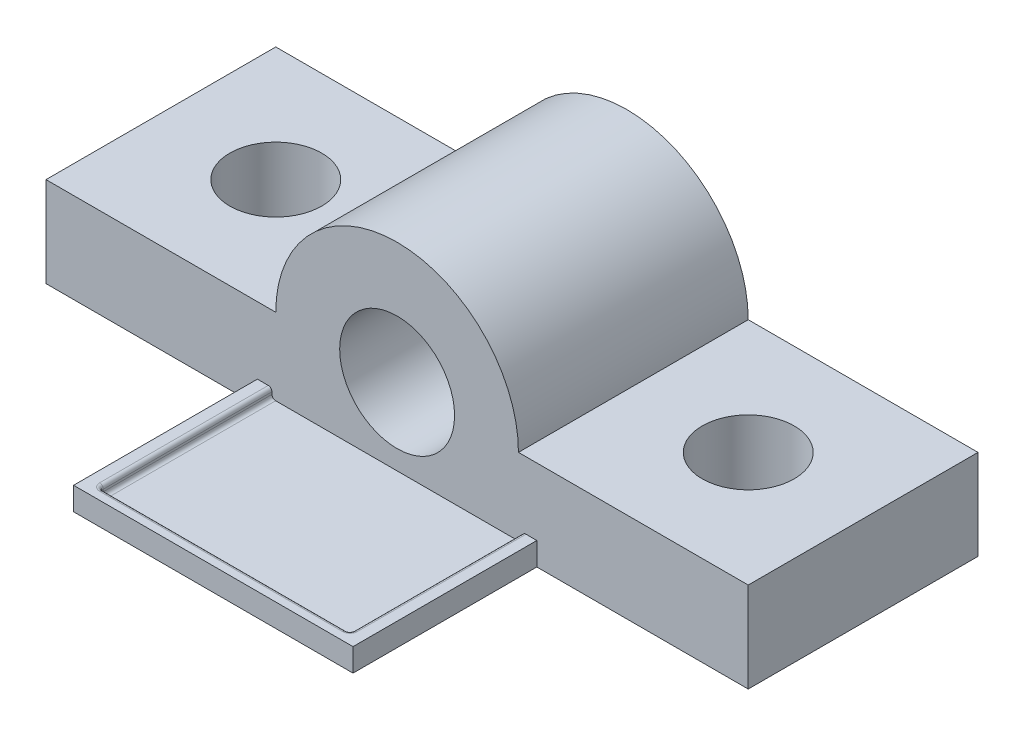
ISO-10303-21;
HEADER;
FILE_DESCRIPTION(('STEP AP214'),'2;1');
FILE_NAME('part.step','',(''),(''),'','','');
FILE_SCHEMA(('AUTOMOTIVE_DESIGN { 1 0 10303 214 1 1 1 1 }'));
ENDSEC;
DATA;
#1=APPLICATION_CONTEXT('core data for automotive mechanical design processes');
#2=APPLICATION_PROTOCOL_DEFINITION('international standard','automotive_design',2000,#1);
#3=PRODUCT_CONTEXT('',#1,'mechanical');
#4=PRODUCT('Part','Part','',(#3));
#5=PRODUCT_RELATED_PRODUCT_CATEGORY('part','',(#4));
#6=PRODUCT_DEFINITION_FORMATION('','',#4);
#7=PRODUCT_DEFINITION_CONTEXT('part definition',#1,'design');
#8=PRODUCT_DEFINITION('design','',#6,#7);
#9=PRODUCT_DEFINITION_SHAPE('','',#8);
#10=(LENGTH_UNIT() NAMED_UNIT(*) SI_UNIT(.MILLI.,.METRE.));
#11=(NAMED_UNIT(*) PLANE_ANGLE_UNIT() SI_UNIT($,.RADIAN.));
#12=(NAMED_UNIT(*) SI_UNIT($,.STERADIAN.) SOLID_ANGLE_UNIT());
#13=UNCERTAINTY_MEASURE_WITH_UNIT(LENGTH_MEASURE(1.E-05),#10,'distance_accuracy_value','');
#14=(GEOMETRIC_REPRESENTATION_CONTEXT(3) GLOBAL_UNCERTAINTY_ASSIGNED_CONTEXT((#13)) GLOBAL_UNIT_ASSIGNED_CONTEXT((#10,
#11,#12)) REPRESENTATION_CONTEXT('',''));
#15=CARTESIAN_POINT('',(0.,0.,0.));
#16=DIRECTION('',(0.,0.,1.));
#17=DIRECTION('',(1.,0.,0.));
#18=AXIS2_PLACEMENT_3D('',#15,#16,#17);
#19=CARTESIAN_POINT('',(-6.91794786838429,-19.7916456549118,16.51));
#20=DIRECTION('',(-1.,0.,0.));
#21=DIRECTION('',(0.,0.,1.));
#22=AXIS2_PLACEMENT_3D('',#19,#20,#21);
#23=PLANE('',#22);
#24=DIRECTION('',(0.,0.,-1.));
#25=VECTOR('',#24,1.);
#26=CARTESIAN_POINT('',(-6.91794786838429,-19.9948456549118,16.51));
#27=LINE('',#26,#25);
#28=CARTESIAN_POINT('',(-6.91794786838429,-19.9948456549118,6.35));
#29=VERTEX_POINT('',#28);
#30=CARTESIAN_POINT('',(-6.91794786838429,-19.9948456549118,15.6718));
#31=VERTEX_POINT('',#30);
#32=EDGE_CURVE('E301',#29,#31,#27,.F.);
#33=ORIENTED_EDGE('',*,*,#32,.T.);
#34=DIRECTION('',(0.,-1.,0.));
#35=VECTOR('',#34,1.);
#36=CARTESIAN_POINT('',(-6.91794786838429,-20.1193059575727,15.6718));
#37=LINE('',#36,#35);
#38=CARTESIAN_POINT('',(-6.91794786838429,-20.1193059575727,15.6718));
#39=VERTEX_POINT('',#38);
#40=EDGE_CURVE('E320',#31,#39,#37,.T.);
#41=ORIENTED_EDGE('',*,*,#40,.T.);
#42=DIRECTION('',(0.,0.,-1.));
#43=VECTOR('',#42,1.);
#44=CARTESIAN_POINT('',(-6.91794786838429,-20.1193059575727,6.35));
#45=LINE('',#44,#43);
#46=CARTESIAN_POINT('',(-6.91794786838429,-20.1193059575727,6.35));
#47=VERTEX_POINT('',#46);
#48=EDGE_CURVE('E299',#39,#47,#45,.T.);
#49=ORIENTED_EDGE('',*,*,#48,.T.);
#50=DIRECTION('',(0.,1.,0.));
#51=VECTOR('',#50,1.);
#52=CARTESIAN_POINT('',(-6.91794786838429,-19.7916456549118,6.35));
#53=LINE('',#52,#51);
#54=EDGE_CURVE('E215',#47,#29,#53,.T.);
#55=ORIENTED_EDGE('',*,*,#54,.T.);
#56=EDGE_LOOP('',(#33,#41,#49,#55));
#57=FACE_BOUND('',#56,.T.);
#58=ADVANCED_FACE('F35',(#57),#23,.F.);
#59=CARTESIAN_POINT('',(6.91794786838429,-19.7916456549118,16.51));
#60=DIRECTION('',(1.,0.,0.));
#61=DIRECTION('',(0.,0.,-1.));
#62=AXIS2_PLACEMENT_3D('',#59,#60,#61);
#63=PLANE('',#62);
#64=DIRECTION('',(0.,0.,-1.));
#65=VECTOR('',#64,1.);
#66=CARTESIAN_POINT('',(6.91794786838429,-20.1193059575727,16.51));
#67=LINE('',#66,#65);
#68=CARTESIAN_POINT('',(6.91794786838429,-20.1193059575727,6.35));
#69=VERTEX_POINT('',#68);
#70=CARTESIAN_POINT('',(6.91794786838429,-20.1193059575727,15.6718));
#71=VERTEX_POINT('',#70);
#72=EDGE_CURVE('E290',#69,#71,#67,.F.);
#73=ORIENTED_EDGE('',*,*,#72,.T.);
#74=DIRECTION('',(0.,1.,0.));
#75=VECTOR('',#74,1.);
#76=CARTESIAN_POINT('',(6.91794786838429,-19.9948456549118,15.6718));
#77=LINE('',#76,#75);
#78=CARTESIAN_POINT('',(6.91794786838429,-19.9948456549118,15.6718));
#79=VERTEX_POINT('',#78);
#80=EDGE_CURVE('E335',#71,#79,#77,.T.);
#81=ORIENTED_EDGE('',*,*,#80,.T.);
#82=DIRECTION('',(0.,0.,-1.));
#83=VECTOR('',#82,1.);
#84=CARTESIAN_POINT('',(6.91794786838429,-19.9948456549118,16.51));
#85=LINE('',#84,#83);
#86=CARTESIAN_POINT('',(6.91794786838429,-19.9948456549118,6.35));
#87=VERTEX_POINT('',#86);
#88=EDGE_CURVE('E293',#79,#87,#85,.T.);
#89=ORIENTED_EDGE('',*,*,#88,.T.);
#90=DIRECTION('',(0.,-1.,0.));
#91=VECTOR('',#90,1.);
#92=CARTESIAN_POINT('',(6.91794786838429,-19.7916456549118,6.35));
#93=LINE('',#92,#91);
#94=EDGE_CURVE('E208',#87,#69,#93,.T.);
#95=ORIENTED_EDGE('',*,*,#94,.T.);
#96=EDGE_LOOP('',(#73,#81,#89,#95));
#97=FACE_BOUND('',#96,.T.);
#98=ADVANCED_FACE('F379',(#97),#63,.F.);
#99=CARTESIAN_POINT('',(6.91794786838429,-20.3225059575727,16.51));
#100=DIRECTION('',(0.,-1.,0.));
#101=DIRECTION('',(0.,0.,-1.));
#102=AXIS2_PLACEMENT_3D('',#99,#100,#101);
#103=PLANE('',#102);
#104=DIRECTION('',(0.,0.,-1.));
#105=VECTOR('',#104,1.);
#106=CARTESIAN_POINT('',(-6.71474786838429,-20.3225059575727,16.51));
#107=LINE('',#106,#105);
#108=CARTESIAN_POINT('',(-6.71474786838429,-20.3225059575727,6.35));
#109=VERTEX_POINT('',#108);
#110=CARTESIAN_POINT('',(-6.71474786838429,-20.3225059575727,15.6718));
#111=VERTEX_POINT('',#110);
#112=EDGE_CURVE('E304',#109,#111,#107,.F.);
#113=ORIENTED_EDGE('',*,*,#112,.T.);
#114=DIRECTION('',(1.,0.,0.));
#115=VECTOR('',#114,1.);
#116=CARTESIAN_POINT('',(6.71474786838429,-20.3225059575727,15.6718));
#117=LINE('',#116,#115);
#118=CARTESIAN_POINT('',(6.71474786838429,-20.3225059575727,15.6718));
#119=VERTEX_POINT('',#118);
#120=EDGE_CURVE('E340',#111,#119,#117,.T.);
#121=ORIENTED_EDGE('',*,*,#120,.T.);
#122=DIRECTION('',(0.,0.,-1.));
#123=VECTOR('',#122,1.);
#124=CARTESIAN_POINT('',(6.71474786838429,-20.3225059575727,6.35));
#125=LINE('',#124,#123);
#126=CARTESIAN_POINT('',(6.71474786838429,-20.3225059575727,6.35));
#127=VERTEX_POINT('',#126);
#128=EDGE_CURVE('E307',#119,#127,#125,.T.);
#129=ORIENTED_EDGE('',*,*,#128,.T.);
#130=DIRECTION('',(-1.,0.,0.));
#131=VECTOR('',#130,1.);
#132=CARTESIAN_POINT('',(6.91794786838429,-20.3225059575727,6.35));
#133=LINE('',#132,#131);
#134=EDGE_CURVE('E204',#127,#109,#133,.T.);
#135=ORIENTED_EDGE('',*,*,#134,.T.);
#136=EDGE_LOOP('',(#113,#121,#129,#135));
#137=FACE_BOUND('',#136,.T.);
#138=ADVANCED_FACE('F391',(#137),#103,.F.);
#139=CARTESIAN_POINT('',(7.12114786838429,-19.9948456549118,16.51));
#140=DIRECTION('',(0.,0.,-1.));
#141=DIRECTION('',(-1.,0.,0.));
#142=AXIS2_PLACEMENT_3D('',#139,#140,#141);
#143=CYLINDRICAL_SURFACE('',#142,0.2032);
#144=ORIENTED_EDGE('',*,*,#88,.F.);
#145=CARTESIAN_POINT('',(7.12114786838429,-19.9948456549118,15.6718));
#146=DIRECTION('',(0.,0.,-1.));
#147=DIRECTION('',(-1.,0.,0.));
#148=AXIS2_PLACEMENT_3D('',#145,#146,#147);
#149=CIRCLE('',#148,0.2032);
#150=CARTESIAN_POINT('',(7.12114786838429,-19.7916456549118,15.6718));
#151=VERTEX_POINT('',#150);
#152=EDGE_CURVE('E333',#79,#151,#149,.T.);
#153=ORIENTED_EDGE('',*,*,#152,.T.);
#154=DIRECTION('',(0.,0.,-1.));
#155=VECTOR('',#154,1.);
#156=CARTESIAN_POINT('',(7.12114786838429,-19.7916456549118,16.51));
#157=LINE('',#156,#155);
#158=CARTESIAN_POINT('',(7.12114786838429,-19.7916456549118,6.35));
#159=VERTEX_POINT('',#158);
#160=EDGE_CURVE('E295',#159,#151,#157,.F.);
#161=ORIENTED_EDGE('',*,*,#160,.F.);
#162=CARTESIAN_POINT('',(7.12114786838429,-19.9948456549118,6.35));
#163=DIRECTION('',(0.,0.,1.));
#164=DIRECTION('',(1.,0.,0.));
#165=AXIS2_PLACEMENT_3D('',#162,#163,#164);
#166=CIRCLE('',#165,0.2032);
#167=EDGE_CURVE('E313',#87,#159,#166,.F.);
#168=ORIENTED_EDGE('',*,*,#167,.F.);
#169=EDGE_LOOP('',(#144,#153,#161,#168));
#170=FACE_BOUND('',#169,.T.);
#171=ADVANCED_FACE('F433',(#170),#143,.T.);
#172=CARTESIAN_POINT('',(-7.12114786838429,-19.9948456549118,16.51));
#173=DIRECTION('',(0.,0.,-1.));
#174=DIRECTION('',(-1.,0.,0.));
#175=AXIS2_PLACEMENT_3D('',#172,#173,#174);
#176=CYLINDRICAL_SURFACE('',#175,0.2032);
#177=DIRECTION('',(0.,0.,-1.));
#178=VECTOR('',#177,1.);
#179=CARTESIAN_POINT('',(-7.12114786838429,-19.7916456549118,16.51));
#180=LINE('',#179,#178);
#181=CARTESIAN_POINT('',(-7.12114786838429,-19.7916456549118,15.6718));
#182=VERTEX_POINT('',#181);
#183=CARTESIAN_POINT('',(-7.12114786838429,-19.7916456549118,6.35));
#184=VERTEX_POINT('',#183);
#185=EDGE_CURVE('E297',#182,#184,#180,.T.);
#186=ORIENTED_EDGE('',*,*,#185,.F.);
#187=CARTESIAN_POINT('',(-7.12114786838429,-19.9948456549118,15.6718));
#188=DIRECTION('',(0.,0.,-1.));
#189=DIRECTION('',(-1.,0.,0.));
#190=AXIS2_PLACEMENT_3D('',#187,#188,#189);
#191=CIRCLE('',#190,0.2032);
#192=EDGE_CURVE('E317',#182,#31,#191,.T.);
#193=ORIENTED_EDGE('',*,*,#192,.T.);
#194=ORIENTED_EDGE('',*,*,#32,.F.);
#195=CARTESIAN_POINT('',(-7.12114786838429,-19.9948456549118,6.35));
#196=DIRECTION('',(0.,0.,1.));
#197=DIRECTION('',(1.,0.,0.));
#198=AXIS2_PLACEMENT_3D('',#195,#196,#197);
#199=CIRCLE('',#198,0.2032);
#200=EDGE_CURVE('E315',#184,#29,#199,.F.);
#201=ORIENTED_EDGE('',*,*,#200,.F.);
#202=EDGE_LOOP('',(#186,#193,#194,#201));
#203=FACE_BOUND('',#202,.T.);
#204=ADVANCED_FACE('F421',(#203),#176,.T.);
#205=CARTESIAN_POINT('',(6.71474786838429,-20.1193059575727,16.51));
#206=DIRECTION('',(0.,0.,1.));
#207=DIRECTION('',(1.,0.,0.));
#208=AXIS2_PLACEMENT_3D('',#205,#206,#207);
#209=CYLINDRICAL_SURFACE('',#208,0.2032);
#210=ORIENTED_EDGE('',*,*,#128,.F.);
#211=CARTESIAN_POINT('',(6.71474786838429,-20.1193059575727,15.6718));
#212=DIRECTION('',(0.,0.,1.));
#213=DIRECTION('',(1.,0.,0.));
#214=AXIS2_PLACEMENT_3D('',#211,#212,#213);
#215=CIRCLE('',#214,0.2032);
#216=EDGE_CURVE('E337',#119,#71,#215,.T.);
#217=ORIENTED_EDGE('',*,*,#216,.T.);
#218=ORIENTED_EDGE('',*,*,#72,.F.);
#219=CARTESIAN_POINT('',(6.71474786838429,-20.1193059575727,6.35));
#220=DIRECTION('',(0.,0.,1.));
#221=DIRECTION('',(1.,0.,0.));
#222=AXIS2_PLACEMENT_3D('',#219,#220,#221);
#223=CIRCLE('',#222,0.2032);
#224=EDGE_CURVE('E311',#127,#69,#223,.T.);
#225=ORIENTED_EDGE('',*,*,#224,.F.);
#226=EDGE_LOOP('',(#210,#217,#218,#225));
#227=FACE_BOUND('',#226,.T.);
#228=ADVANCED_FACE('F376',(#227),#209,.F.);
#229=CARTESIAN_POINT('',(-6.71474786838429,-20.1193059575727,16.51));
#230=DIRECTION('',(0.,0.,1.));
#231=DIRECTION('',(1.,0.,0.));
#232=AXIS2_PLACEMENT_3D('',#229,#230,#231);
#233=CYLINDRICAL_SURFACE('',#232,0.2032);
#234=ORIENTED_EDGE('',*,*,#48,.F.);
#235=CARTESIAN_POINT('',(-6.71474786838429,-20.1193059575727,15.6718));
#236=DIRECTION('',(0.,0.,1.));
#237=DIRECTION('',(1.,0.,0.));
#238=AXIS2_PLACEMENT_3D('',#235,#236,#237);
#239=CIRCLE('',#238,0.2032);
#240=EDGE_CURVE('E331',#39,#111,#239,.T.);
#241=ORIENTED_EDGE('',*,*,#240,.T.);
#242=ORIENTED_EDGE('',*,*,#112,.F.);
#243=CARTESIAN_POINT('',(-6.71474786838429,-20.1193059575727,6.35));
#244=DIRECTION('',(0.,0.,1.));
#245=DIRECTION('',(1.,0.,0.));
#246=AXIS2_PLACEMENT_3D('',#243,#244,#245);
#247=CIRCLE('',#246,0.2032);
#248=EDGE_CURVE('E309',#47,#109,#247,.T.);
#249=ORIENTED_EDGE('',*,*,#248,.F.);
#250=EDGE_LOOP('',(#234,#241,#242,#249));
#251=FACE_BOUND('',#250,.T.);
#252=ADVANCED_FACE('F394',(#251),#233,.F.);
#253=CARTESIAN_POINT('',(0.,-16.0818556559255,6.35));
#254=DIRECTION('',(0.,0.,-1.));
#255=DIRECTION('',(-1.,0.,0.));
#256=AXIS2_PLACEMENT_3D('',#253,#254,#255);
#257=CYLINDRICAL_SURFACE('',#256,3.175);
#258=CARTESIAN_POINT('',(0.,-16.0818556559255,6.35));
#259=DIRECTION('',(0.,0.,1.));
#260=DIRECTION('',(1.,0.,0.));
#261=AXIS2_PLACEMENT_3D('',#258,#259,#260);
#262=CIRCLE('',#261,3.175);
#263=CARTESIAN_POINT('',(3.175,-16.0818556559255,6.35));
#264=VERTEX_POINT('',#263);
#265=EDGE_CURVE('E242',#264,#264,#262,.T.);
#266=ORIENTED_EDGE('',*,*,#265,.T.);
#267=EDGE_LOOP('',(#266));
#268=FACE_BOUND('',#267,.T.);
#269=CARTESIAN_POINT('',(0.,-16.0818556559255,-3.81));
#270=DIRECTION('',(0.,0.,-1.));
#271=DIRECTION('',(-1.,0.,0.));
#272=AXIS2_PLACEMENT_3D('',#269,#270,#271);
#273=CIRCLE('',#272,3.175);
#274=CARTESIAN_POINT('',(-3.175,-16.0818556559255,-3.81));
#275=VERTEX_POINT('',#274);
#276=EDGE_CURVE('E237',#275,#275,#273,.T.);
#277=ORIENTED_EDGE('',*,*,#276,.T.);
#278=EDGE_LOOP('',(#277));
#279=FACE_BOUND('',#278,.T.);
#280=ADVANCED_FACE('F462',(#268,#279),#257,.F.);
#281=CARTESIAN_POINT('',(0.,-16.0818556559255,6.35));
#282=DIRECTION('',(0.,0.,1.));
#283=DIRECTION('',(1.,0.,0.));
#284=AXIS2_PLACEMENT_3D('',#281,#282,#283);
#285=PLANE('',#284);
#286=ORIENTED_EDGE('',*,*,#134,.F.);
#287=ORIENTED_EDGE('',*,*,#224,.T.);
#288=ORIENTED_EDGE('',*,*,#94,.F.);
#289=ORIENTED_EDGE('',*,*,#167,.T.);
#290=DIRECTION('',(-1.,0.,0.));
#291=VECTOR('',#290,1.);
#292=CARTESIAN_POINT('',(7.72314580949107,-19.7916456549118,6.35));
#293=LINE('',#292,#291);
#294=CARTESIAN_POINT('',(7.72314580949107,-19.7916456549118,6.35));
#295=VERTEX_POINT('',#294);
#296=EDGE_CURVE('E224',#295,#159,#293,.T.);
#297=ORIENTED_EDGE('',*,*,#296,.F.);
#298=DIRECTION('',(0.,1.,0.));
#299=VECTOR('',#298,1.);
#300=CARTESIAN_POINT('',(7.72314580949107,-21.0616456549118,6.35));
#301=LINE('',#300,#299);
#302=CARTESIAN_POINT('',(7.72314580949107,-21.0616456549118,6.35));
#303=VERTEX_POINT('',#302);
#304=EDGE_CURVE('E221',#303,#295,#301,.T.);
#305=ORIENTED_EDGE('',*,*,#304,.F.);
#306=DIRECTION('',(1.,0.,0.));
#307=VECTOR('',#306,1.);
#308=CARTESIAN_POINT('',(-19.4067372061803,-21.0616456549118,6.35));
#309=LINE('',#308,#307);
#310=CARTESIAN_POINT('',(19.4067372061803,-21.0616456549118,6.35));
#311=VERTEX_POINT('',#310);
#312=EDGE_CURVE('E254',#303,#311,#309,.T.);
#313=ORIENTED_EDGE('',*,*,#312,.T.);
#314=DIRECTION('',(0.,1.,0.));
#315=VECTOR('',#314,1.);
#316=CARTESIAN_POINT('',(19.4067372061803,-16.0818556559255,6.35));
#317=LINE('',#316,#315);
#318=CARTESIAN_POINT('',(19.4067372061803,-16.0818556559255,6.35));
#319=VERTEX_POINT('',#318);
#320=EDGE_CURVE('E257',#311,#319,#317,.T.);
#321=ORIENTED_EDGE('',*,*,#320,.T.);
#322=DIRECTION('',(-1.,0.,0.));
#323=VECTOR('',#322,1.);
#324=CARTESIAN_POINT('',(6.70673720618031,-16.0818556559255,6.35));
#325=LINE('',#324,#323);
#326=CARTESIAN_POINT('',(6.70673720618031,-16.0818556559255,6.35));
#327=VERTEX_POINT('',#326);
#328=EDGE_CURVE('E259',#319,#327,#325,.T.);
#329=ORIENTED_EDGE('',*,*,#328,.T.);
#330=CARTESIAN_POINT('',(0.,-16.0818556559255,6.35));
#331=DIRECTION('',(0.,0.,1.));
#332=DIRECTION('',(1.,0.,0.));
#333=AXIS2_PLACEMENT_3D('',#330,#331,#332);
#334=CIRCLE('',#333,6.70673720618031);
#335=CARTESIAN_POINT('',(-6.70673720618031,-16.0818556559255,6.35));
#336=VERTEX_POINT('',#335);
#337=EDGE_CURVE('E246',#327,#336,#334,.T.);
#338=ORIENTED_EDGE('',*,*,#337,.T.);
#339=DIRECTION('',(-1.,0.,0.));
#340=VECTOR('',#339,1.);
#341=CARTESIAN_POINT('',(-6.70673720618031,-16.0818556559255,6.35));
#342=LINE('',#341,#340);
#343=CARTESIAN_POINT('',(-19.4067372061803,-16.0818556559255,6.35));
#344=VERTEX_POINT('',#343);
#345=EDGE_CURVE('E249',#336,#344,#342,.T.);
#346=ORIENTED_EDGE('',*,*,#345,.T.);
#347=DIRECTION('',(0.,-1.,0.));
#348=VECTOR('',#347,1.);
#349=CARTESIAN_POINT('',(-19.4067372061803,-16.0818556559255,6.35));
#350=LINE('',#349,#348);
#351=CARTESIAN_POINT('',(-19.4067372061803,-21.0616456549118,6.35));
#352=VERTEX_POINT('',#351);
#353=EDGE_CURVE('E252',#344,#352,#350,.T.);
#354=ORIENTED_EDGE('',*,*,#353,.T.);
#355=CARTESIAN_POINT('',(-7.72314580949107,-21.0616456549118,6.35));
#356=VERTEX_POINT('',#355);
#357=EDGE_CURVE('E255',#352,#356,#309,.T.);
#358=ORIENTED_EDGE('',*,*,#357,.T.);
#359=DIRECTION('',(0.,-1.,0.));
#360=VECTOR('',#359,1.);
#361=CARTESIAN_POINT('',(-7.72314580949107,-21.0616456549118,6.35));
#362=LINE('',#361,#360);
#363=CARTESIAN_POINT('',(-7.72314580949107,-19.7916456549118,6.35));
#364=VERTEX_POINT('',#363);
#365=EDGE_CURVE('E219',#364,#356,#362,.T.);
#366=ORIENTED_EDGE('',*,*,#365,.F.);
#367=DIRECTION('',(-1.,0.,0.));
#368=VECTOR('',#367,1.);
#369=CARTESIAN_POINT('',(-7.72314580949107,-19.7916456549118,6.35));
#370=LINE('',#369,#368);
#371=EDGE_CURVE('E193',#184,#364,#370,.T.);
#372=ORIENTED_EDGE('',*,*,#371,.F.);
#373=ORIENTED_EDGE('',*,*,#200,.T.);
#374=ORIENTED_EDGE('',*,*,#54,.F.);
#375=ORIENTED_EDGE('',*,*,#248,.T.);
#376=EDGE_LOOP('',(#286,#287,#288,#289,#297,#305,#313,#321,#329,#338,#346,#354,#358,#366,#372,
#373,#374,#375));
#377=FACE_BOUND('',#376,.T.);
#378=ORIENTED_EDGE('',*,*,#265,.F.);
#379=EDGE_LOOP('',(#378));
#380=FACE_BOUND('',#379,.T.);
#381=ADVANCED_FACE('F385',(#377,#380),#285,.T.);
#382=CARTESIAN_POINT('',(0.,-16.0818556559255,-6.35));
#383=DIRECTION('',(0.,0.,1.));
#384=DIRECTION('',(1.,0.,0.));
#385=AXIS2_PLACEMENT_3D('',#382,#383,#384);
#386=PLANE('',#385);
#387=CARTESIAN_POINT('',(0.,-16.0818556559255,-6.35));
#388=DIRECTION('',(0.,0.,1.));
#389=DIRECTION('',(1.,0.,0.));
#390=AXIS2_PLACEMENT_3D('',#387,#388,#389);
#391=CIRCLE('',#390,6.70673720618031);
#392=CARTESIAN_POINT('',(6.70673720618031,-16.0818556559255,-6.35));
#393=VERTEX_POINT('',#392);
#394=CARTESIAN_POINT('',(-6.70673720618031,-16.0818556559255,-6.35));
#395=VERTEX_POINT('',#394);
#396=EDGE_CURVE('E245',#393,#395,#391,.T.);
#397=ORIENTED_EDGE('',*,*,#396,.F.);
#398=DIRECTION('',(-1.,0.,0.));
#399=VECTOR('',#398,1.);
#400=CARTESIAN_POINT('',(6.70673720618031,-16.0818556559255,-6.35));
#401=LINE('',#400,#399);
#402=CARTESIAN_POINT('',(19.4067372061803,-16.0818556559255,-6.35));
#403=VERTEX_POINT('',#402);
#404=EDGE_CURVE('E250',#403,#393,#401,.T.);
#405=ORIENTED_EDGE('',*,*,#404,.F.);
#406=DIRECTION('',(0.,1.,0.));
#407=VECTOR('',#406,1.);
#408=CARTESIAN_POINT('',(19.4067372061803,-16.0818556559255,-6.35));
#409=LINE('',#408,#407);
#410=CARTESIAN_POINT('',(19.4067372061803,-21.0616456549118,-6.35));
#411=VERTEX_POINT('',#410);
#412=EDGE_CURVE('E270',#411,#403,#409,.T.);
#413=ORIENTED_EDGE('',*,*,#412,.F.);
#414=DIRECTION('',(1.,0.,0.));
#415=VECTOR('',#414,1.);
#416=CARTESIAN_POINT('',(-19.4067372061803,-21.0616456549118,-6.35));
#417=LINE('',#416,#415);
#418=CARTESIAN_POINT('',(-19.4067372061803,-21.0616456549118,-6.35));
#419=VERTEX_POINT('',#418);
#420=EDGE_CURVE('E268',#419,#411,#417,.T.);
#421=ORIENTED_EDGE('',*,*,#420,.F.);
#422=DIRECTION('',(0.,-1.,0.));
#423=VECTOR('',#422,1.);
#424=CARTESIAN_POINT('',(-19.4067372061803,-16.0818556559255,-6.35));
#425=LINE('',#424,#423);
#426=CARTESIAN_POINT('',(-19.4067372061803,-16.0818556559255,-6.35));
#427=VERTEX_POINT('',#426);
#428=EDGE_CURVE('E266',#427,#419,#425,.T.);
#429=ORIENTED_EDGE('',*,*,#428,.F.);
#430=DIRECTION('',(-1.,0.,0.));
#431=VECTOR('',#430,1.);
#432=CARTESIAN_POINT('',(-6.70673720618031,-16.0818556559255,-6.35));
#433=LINE('',#432,#431);
#434=EDGE_CURVE('E264',#395,#427,#433,.T.);
#435=ORIENTED_EDGE('',*,*,#434,.F.);
#436=EDGE_LOOP('',(#397,#405,#413,#421,#429,#435));
#437=FACE_BOUND('',#436,.T.);
#438=CARTESIAN_POINT('',(0.,-16.0818556559255,-6.35));
#439=DIRECTION('',(0.,0.,-1.));
#440=DIRECTION('',(-1.,0.,0.));
#441=AXIS2_PLACEMENT_3D('',#438,#439,#440);
#442=CIRCLE('',#441,1.325695341336);
#443=CARTESIAN_POINT('',(-1.325695341336,-16.0818556559255,-6.35));
#444=VERTEX_POINT('',#443);
#445=EDGE_CURVE('E197',#444,#444,#442,.T.);
#446=ORIENTED_EDGE('',*,*,#445,.F.);
#447=EDGE_LOOP('',(#446));
#448=FACE_BOUND('',#447,.T.);
#449=ADVANCED_FACE('F468',(#437,#448),#386,.F.);
#450=CARTESIAN_POINT('',(0.,-16.0818556559255,6.35));
#451=DIRECTION('',(0.,0.,-1.));
#452=DIRECTION('',(-1.,0.,0.));
#453=AXIS2_PLACEMENT_3D('',#450,#451,#452);
#454=CYLINDRICAL_SURFACE('',#453,6.70673720618031);
#455=ORIENTED_EDGE('',*,*,#396,.T.);
#456=DIRECTION('',(0.,0.,-1.));
#457=VECTOR('',#456,1.);
#458=CARTESIAN_POINT('',(-6.70673720618031,-16.0818556559255,6.35));
#459=LINE('',#458,#457);
#460=EDGE_CURVE('E287',#336,#395,#459,.T.);
#461=ORIENTED_EDGE('',*,*,#460,.F.);
#462=ORIENTED_EDGE('',*,*,#337,.F.);
#463=DIRECTION('',(0.,0.,-1.));
#464=VECTOR('',#463,1.);
#465=CARTESIAN_POINT('',(6.70673720618031,-16.0818556559255,6.35));
#466=LINE('',#465,#464);
#467=EDGE_CURVE('E261',#327,#393,#466,.T.);
#468=ORIENTED_EDGE('',*,*,#467,.T.);
#469=EDGE_LOOP('',(#455,#461,#462,#468));
#470=FACE_BOUND('',#469,.T.);
#471=ADVANCED_FACE('F471',(#470),#454,.T.);
#472=CARTESIAN_POINT('',(-6.70673720618031,-16.0818556559255,6.35));
#473=DIRECTION('',(0.,-1.,0.));
#474=DIRECTION('',(0.,0.,-1.));
#475=AXIS2_PLACEMENT_3D('',#472,#473,#474);
#476=PLANE('',#475);
#477=CARTESIAN_POINT('',(-13.0567372061803,-16.0818556559255,0.));
#478=DIRECTION('',(0.,1.,0.));
#479=DIRECTION('',(0.,0.,1.));
#480=AXIS2_PLACEMENT_3D('',#477,#478,#479);
#481=CIRCLE('',#480,2.54);
#482=CARTESIAN_POINT('',(-13.0567372061803,-16.0818556559255,2.54));
#483=VERTEX_POINT('',#482);
#484=EDGE_CURVE('E768',#483,#483,#481,.T.);
#485=ORIENTED_EDGE('',*,*,#484,.F.);
#486=EDGE_LOOP('',(#485));
#487=FACE_BOUND('',#486,.T.);
#488=ORIENTED_EDGE('',*,*,#434,.T.);
#489=DIRECTION('',(0.,0.,-1.));
#490=VECTOR('',#489,1.);
#491=CARTESIAN_POINT('',(-19.4067372061803,-16.0818556559255,6.35));
#492=LINE('',#491,#490);
#493=EDGE_CURVE('E284',#344,#427,#492,.T.);
#494=ORIENTED_EDGE('',*,*,#493,.F.);
#495=ORIENTED_EDGE('',*,*,#345,.F.);
#496=ORIENTED_EDGE('',*,*,#460,.T.);
#497=EDGE_LOOP('',(#488,#494,#495,#496));
#498=FACE_BOUND('',#497,.T.);
#499=ADVANCED_FACE('F486',(#487,#498),#476,.F.);
#500=CARTESIAN_POINT('',(-19.4067372061803,-16.0818556559255,6.35));
#501=DIRECTION('',(1.,0.,0.));
#502=DIRECTION('',(0.,0.,-1.));
#503=AXIS2_PLACEMENT_3D('',#500,#501,#502);
#504=PLANE('',#503);
#505=ORIENTED_EDGE('',*,*,#428,.T.);
#506=DIRECTION('',(0.,0.,-1.));
#507=VECTOR('',#506,1.);
#508=CARTESIAN_POINT('',(-19.4067372061803,-21.0616456549118,6.35));
#509=LINE('',#508,#507);
#510=EDGE_CURVE('E281',#352,#419,#509,.T.);
#511=ORIENTED_EDGE('',*,*,#510,.F.);
#512=ORIENTED_EDGE('',*,*,#353,.F.);
#513=ORIENTED_EDGE('',*,*,#493,.T.);
#514=EDGE_LOOP('',(#505,#511,#512,#513));
#515=FACE_BOUND('',#514,.T.);
#516=ADVANCED_FACE('F482',(#515),#504,.F.);
#517=CARTESIAN_POINT('',(-19.4067372061803,-21.0616456549118,6.35));
#518=DIRECTION('',(0.,1.,0.));
#519=DIRECTION('',(0.,0.,1.));
#520=AXIS2_PLACEMENT_3D('',#517,#518,#519);
#521=PLANE('',#520);
#522=CARTESIAN_POINT('',(-13.0567372061803,-21.0616456549118,0.));
#523=DIRECTION('',(0.,1.,0.));
#524=DIRECTION('',(0.,0.,1.));
#525=AXIS2_PLACEMENT_3D('',#522,#523,#524);
#526=CIRCLE('',#525,2.54);
#527=CARTESIAN_POINT('',(-13.0567372061803,-21.0616456549118,2.54));
#528=VERTEX_POINT('',#527);
#529=EDGE_CURVE('E765',#528,#528,#526,.F.);
#530=ORIENTED_EDGE('',*,*,#529,.F.);
#531=EDGE_LOOP('',(#530));
#532=FACE_BOUND('',#531,.T.);
#533=CARTESIAN_POINT('',(13.0567372061803,-21.0616456549118,0.));
#534=DIRECTION('',(0.,1.,0.));
#535=DIRECTION('',(0.,0.,1.));
#536=AXIS2_PLACEMENT_3D('',#533,#534,#535);
#537=CIRCLE('',#536,2.54);
#538=CARTESIAN_POINT('',(13.0567372061803,-21.0616456549118,2.54));
#539=VERTEX_POINT('',#538);
#540=EDGE_CURVE('E211',#539,#539,#537,.F.);
#541=ORIENTED_EDGE('',*,*,#540,.F.);
#542=EDGE_LOOP('',(#541));
#543=FACE_BOUND('',#542,.T.);
#544=ORIENTED_EDGE('',*,*,#420,.T.);
#545=DIRECTION('',(0.,0.,-1.));
#546=VECTOR('',#545,1.);
#547=CARTESIAN_POINT('',(19.4067372061803,-21.0616456549118,6.35));
#548=LINE('',#547,#546);
#549=EDGE_CURVE('E278',#311,#411,#548,.T.);
#550=ORIENTED_EDGE('',*,*,#549,.F.);
#551=ORIENTED_EDGE('',*,*,#312,.F.);
#552=DIRECTION('',(0.,0.,-1.));
#553=VECTOR('',#552,1.);
#554=CARTESIAN_POINT('',(7.72314580949107,-21.0616456549118,16.51));
#555=LINE('',#554,#553);
#556=CARTESIAN_POINT('',(7.72314580949107,-21.0616456549118,16.51));
#557=VERTEX_POINT('',#556);
#558=EDGE_CURVE('E230',#557,#303,#555,.T.);
#559=ORIENTED_EDGE('',*,*,#558,.F.);
#560=DIRECTION('',(1.,0.,0.));
#561=VECTOR('',#560,1.);
#562=CARTESIAN_POINT('',(-7.72314580949107,-21.0616456549118,16.51));
#563=LINE('',#562,#561);
#564=CARTESIAN_POINT('',(-7.72314580949107,-21.0616456549118,16.51));
#565=VERTEX_POINT('',#564);
#566=EDGE_CURVE('E203',#565,#557,#563,.T.);
#567=ORIENTED_EDGE('',*,*,#566,.F.);
#568=DIRECTION('',(0.,0.,-1.));
#569=VECTOR('',#568,1.);
#570=CARTESIAN_POINT('',(-7.72314580949107,-21.0616456549118,16.51));
#571=LINE('',#570,#569);
#572=EDGE_CURVE('E198',#565,#356,#571,.T.);
#573=ORIENTED_EDGE('',*,*,#572,.T.);
#574=ORIENTED_EDGE('',*,*,#357,.F.);
#575=ORIENTED_EDGE('',*,*,#510,.T.);
#576=EDGE_LOOP('',(#544,#550,#551,#559,#567,#573,#574,#575));
#577=FACE_BOUND('',#576,.T.);
#578=ADVANCED_FACE('F425',(#532,#543,#577),#521,.F.);
#579=CARTESIAN_POINT('',(19.4067372061803,-16.0818556559255,6.35));
#580=DIRECTION('',(-1.,0.,0.));
#581=DIRECTION('',(0.,0.,1.));
#582=AXIS2_PLACEMENT_3D('',#579,#580,#581);
#583=PLANE('',#582);
#584=ORIENTED_EDGE('',*,*,#412,.T.);
#585=DIRECTION('',(0.,0.,-1.));
#586=VECTOR('',#585,1.);
#587=CARTESIAN_POINT('',(19.4067372061803,-16.0818556559255,6.35));
#588=LINE('',#587,#586);
#589=EDGE_CURVE('E275',#319,#403,#588,.T.);
#590=ORIENTED_EDGE('',*,*,#589,.F.);
#591=ORIENTED_EDGE('',*,*,#320,.F.);
#592=ORIENTED_EDGE('',*,*,#549,.T.);
#593=EDGE_LOOP('',(#584,#590,#591,#592));
#594=FACE_BOUND('',#593,.T.);
#595=ADVANCED_FACE('F475',(#594),#583,.F.);
#596=CARTESIAN_POINT('',(6.70673720618031,-16.0818556559255,6.35));
#597=DIRECTION('',(0.,-1.,0.));
#598=DIRECTION('',(0.,0.,-1.));
#599=AXIS2_PLACEMENT_3D('',#596,#597,#598);
#600=PLANE('',#599);
#601=CARTESIAN_POINT('',(13.0567372061803,-16.0818556559255,0.));
#602=DIRECTION('',(0.,1.,0.));
#603=DIRECTION('',(0.,0.,1.));
#604=AXIS2_PLACEMENT_3D('',#601,#602,#603);
#605=CIRCLE('',#604,2.54);
#606=CARTESIAN_POINT('',(13.0567372061803,-16.0818556559255,2.54));
#607=VERTEX_POINT('',#606);
#608=EDGE_CURVE('E770',#607,#607,#605,.T.);
#609=ORIENTED_EDGE('',*,*,#608,.F.);
#610=EDGE_LOOP('',(#609));
#611=FACE_BOUND('',#610,.T.);
#612=ORIENTED_EDGE('',*,*,#404,.T.);
#613=ORIENTED_EDGE('',*,*,#467,.F.);
#614=ORIENTED_EDGE('',*,*,#328,.F.);
#615=ORIENTED_EDGE('',*,*,#589,.T.);
#616=EDGE_LOOP('',(#612,#613,#614,#615));
#617=FACE_BOUND('',#616,.T.);
#618=ADVANCED_FACE('F460',(#611,#617),#600,.F.);
#619=CARTESIAN_POINT('',(0.,-16.0818556559255,-3.81));
#620=DIRECTION('',(0.,0.,-1.));
#621=DIRECTION('',(-1.,0.,0.));
#622=AXIS2_PLACEMENT_3D('',#619,#620,#621);
#623=PLANE('',#622);
#624=CARTESIAN_POINT('',(0.,-16.0818556559255,-3.81));
#625=DIRECTION('',(0.,0.,-1.));
#626=DIRECTION('',(-1.,0.,0.));
#627=AXIS2_PLACEMENT_3D('',#624,#625,#626);
#628=CIRCLE('',#627,1.325695341336);
#629=CARTESIAN_POINT('',(-1.325695341336,-16.0818556559255,-3.81));
#630=VERTEX_POINT('',#629);
#631=EDGE_CURVE('E234',#630,#630,#628,.T.);
#632=ORIENTED_EDGE('',*,*,#631,.T.);
#633=EDGE_LOOP('',(#632));
#634=FACE_BOUND('',#633,.T.);
#635=ORIENTED_EDGE('',*,*,#276,.F.);
#636=EDGE_LOOP('',(#635));
#637=FACE_BOUND('',#636,.T.);
#638=ADVANCED_FACE('F456',(#634,#637),#623,.F.);
#639=CARTESIAN_POINT('',(0.,-16.0818556559255,-3.81));
#640=DIRECTION('',(0.,0.,-1.));
#641=DIRECTION('',(-1.,0.,0.));
#642=AXIS2_PLACEMENT_3D('',#639,#640,#641);
#643=CYLINDRICAL_SURFACE('',#642,1.325695341336);
#644=ORIENTED_EDGE('',*,*,#631,.F.);
#645=EDGE_LOOP('',(#644));
#646=FACE_BOUND('',#645,.T.);
#647=ORIENTED_EDGE('',*,*,#445,.T.);
#648=EDGE_LOOP('',(#647));
#649=FACE_BOUND('',#648,.T.);
#650=ADVANCED_FACE('F453',(#646,#649),#643,.F.);
#651=CARTESIAN_POINT('',(-7.72314580949107,-19.7916456549118,16.51));
#652=DIRECTION('',(0.,-1.,0.));
#653=DIRECTION('',(0.,0.,-1.));
#654=AXIS2_PLACEMENT_3D('',#651,#652,#653);
#655=PLANE('',#654);
#656=DIRECTION('',(-1.,0.,0.));
#657=VECTOR('',#656,1.);
#658=CARTESIAN_POINT('',(-7.72314580949107,-19.7916456549118,16.0782));
#659=LINE('',#658,#657);
#660=CARTESIAN_POINT('',(6.71474786838429,-19.7916456549118,16.0782));
#661=VERTEX_POINT('',#660);
#662=CARTESIAN_POINT('',(-6.71474786838429,-19.7916456549118,16.0782));
#663=VERTEX_POINT('',#662);
#664=EDGE_CURVE('E51',#661,#663,#659,.T.);
#665=ORIENTED_EDGE('',*,*,#664,.T.);
#666=CARTESIAN_POINT('',(-6.71474786838429,-19.7916456549118,15.6718));
#667=DIRECTION('',(0.,-1.,0.));
#668=DIRECTION('',(0.,0.,-1.));
#669=AXIS2_PLACEMENT_3D('',#666,#667,#668);
#670=CIRCLE('',#669,0.4064);
#671=EDGE_CURVE('E11',#663,#182,#670,.T.);
#672=ORIENTED_EDGE('',*,*,#671,.T.);
#673=ORIENTED_EDGE('',*,*,#185,.T.);
#674=ORIENTED_EDGE('',*,*,#371,.T.);
#675=DIRECTION('',(0.,0.,-1.));
#676=VECTOR('',#675,1.);
#677=CARTESIAN_POINT('',(-7.72314580949107,-19.7916456549118,16.51));
#678=LINE('',#677,#676);
#679=CARTESIAN_POINT('',(-7.72314580949107,-19.7916456549118,16.51));
#680=VERTEX_POINT('',#679);
#681=EDGE_CURVE('E190',#680,#364,#678,.T.);
#682=ORIENTED_EDGE('',*,*,#681,.F.);
#683=DIRECTION('',(-1.,0.,0.));
#684=VECTOR('',#683,1.);
#685=CARTESIAN_POINT('',(7.72314580949107,-19.7916456549118,16.51));
#686=LINE('',#685,#684);
#687=CARTESIAN_POINT('',(7.72314580949107,-19.7916456549118,16.51));
#688=VERTEX_POINT('',#687);
#689=EDGE_CURVE('E177',#688,#680,#686,.T.);
#690=ORIENTED_EDGE('',*,*,#689,.F.);
#691=DIRECTION('',(0.,0.,-1.));
#692=VECTOR('',#691,1.);
#693=CARTESIAN_POINT('',(7.72314580949107,-19.7916456549118,16.51));
#694=LINE('',#693,#692);
#695=EDGE_CURVE('E187',#688,#295,#694,.T.);
#696=ORIENTED_EDGE('',*,*,#695,.T.);
#697=ORIENTED_EDGE('',*,*,#296,.T.);
#698=ORIENTED_EDGE('',*,*,#160,.T.);
#699=CARTESIAN_POINT('',(6.71474786838429,-19.7916456549118,15.6718));
#700=DIRECTION('',(0.,-1.,0.));
#701=DIRECTION('',(0.,0.,-1.));
#702=AXIS2_PLACEMENT_3D('',#699,#700,#701);
#703=CIRCLE('',#702,0.4064);
#704=EDGE_CURVE('E44',#151,#661,#703,.T.);
#705=ORIENTED_EDGE('',*,*,#704,.T.);
#706=EDGE_LOOP('',(#665,#672,#673,#674,#682,#690,#696,#697,#698,#705));
#707=FACE_BOUND('',#706,.T.);
#708=ADVANCED_FACE('F191',(#707),#655,.F.);
#709=CARTESIAN_POINT('',(-7.72314580949107,-21.0616456549118,16.51));
#710=DIRECTION('',(1.,0.,0.));
#711=DIRECTION('',(0.,0.,-1.));
#712=AXIS2_PLACEMENT_3D('',#709,#710,#711);
#713=PLANE('',#712);
#714=ORIENTED_EDGE('',*,*,#365,.T.);
#715=ORIENTED_EDGE('',*,*,#572,.F.);
#716=DIRECTION('',(0.,-1.,0.));
#717=VECTOR('',#716,1.);
#718=CARTESIAN_POINT('',(-7.72314580949107,-21.0616456549118,16.51));
#719=LINE('',#718,#717);
#720=EDGE_CURVE('E181',#680,#565,#719,.T.);
#721=ORIENTED_EDGE('',*,*,#720,.F.);
#722=ORIENTED_EDGE('',*,*,#681,.T.);
#723=EDGE_LOOP('',(#714,#715,#721,#722));
#724=FACE_BOUND('',#723,.T.);
#725=ADVANCED_FACE('F200',(#724),#713,.F.);
#726=CARTESIAN_POINT('',(7.72314580949107,-21.0616456549118,16.51));
#727=DIRECTION('',(-1.,0.,0.));
#728=DIRECTION('',(0.,0.,1.));
#729=AXIS2_PLACEMENT_3D('',#726,#727,#728);
#730=PLANE('',#729);
#731=ORIENTED_EDGE('',*,*,#304,.T.);
#732=ORIENTED_EDGE('',*,*,#695,.F.);
#733=DIRECTION('',(0.,1.,0.));
#734=VECTOR('',#733,1.);
#735=CARTESIAN_POINT('',(7.72314580949107,-21.0616456549118,16.51));
#736=LINE('',#735,#734);
#737=EDGE_CURVE('E184',#557,#688,#736,.T.);
#738=ORIENTED_EDGE('',*,*,#737,.F.);
#739=ORIENTED_EDGE('',*,*,#558,.T.);
#740=EDGE_LOOP('',(#731,#732,#738,#739));
#741=FACE_BOUND('',#740,.T.);
#742=ADVANCED_FACE('F430',(#741),#730,.F.);
#743=CARTESIAN_POINT('',(0.,0.,16.51));
#744=DIRECTION('',(0.,0.,-1.));
#745=DIRECTION('',(-1.,0.,0.));
#746=AXIS2_PLACEMENT_3D('',#743,#744,#745);
#747=PLANE('',#746);
#748=ORIENTED_EDGE('',*,*,#689,.T.);
#749=ORIENTED_EDGE('',*,*,#720,.T.);
#750=ORIENTED_EDGE('',*,*,#566,.T.);
#751=ORIENTED_EDGE('',*,*,#737,.T.);
#752=EDGE_LOOP('',(#748,#749,#750,#751));
#753=FACE_BOUND('',#752,.T.);
#754=ADVANCED_FACE('F179',(#753),#747,.F.);
#755=CARTESIAN_POINT('',(7.12114786838429,-19.9948456549118,15.875));
#756=DIRECTION('',(0.,0.,1.));
#757=DIRECTION('',(1.,0.,0.));
#758=AXIS2_PLACEMENT_3D('',#755,#756,#757);
#759=PLANE('',#758);
#760=DIRECTION('',(0.,-1.,0.));
#761=VECTOR('',#760,1.);
#762=CARTESIAN_POINT('',(-6.71474786838429,-19.9948456549118,15.875));
#763=LINE('',#762,#761);
#764=CARTESIAN_POINT('',(-6.71474786838429,-20.1193059575727,15.875));
#765=VERTEX_POINT('',#764);
#766=CARTESIAN_POINT('',(-6.71474786838429,-19.9948456549118,15.875));
#767=VERTEX_POINT('',#766);
#768=EDGE_CURVE('E326',#765,#767,#763,.F.);
#769=ORIENTED_EDGE('',*,*,#768,.T.);
#770=DIRECTION('',(-1.,0.,0.));
#771=VECTOR('',#770,1.);
#772=CARTESIAN_POINT('',(7.12114786838429,-19.9948456549118,15.875));
#773=LINE('',#772,#771);
#774=CARTESIAN_POINT('',(6.71474786838429,-19.9948456549118,15.875));
#775=VERTEX_POINT('',#774);
#776=EDGE_CURVE('E329',#767,#775,#773,.F.);
#777=ORIENTED_EDGE('',*,*,#776,.T.);
#778=DIRECTION('',(0.,1.,0.));
#779=VECTOR('',#778,1.);
#780=CARTESIAN_POINT('',(6.71474786838429,-20.1193059575727,15.875));
#781=LINE('',#780,#779);
#782=CARTESIAN_POINT('',(6.71474786838429,-20.1193059575727,15.875));
#783=VERTEX_POINT('',#782);
#784=EDGE_CURVE('E324',#775,#783,#781,.F.);
#785=ORIENTED_EDGE('',*,*,#784,.T.);
#786=DIRECTION('',(1.,0.,0.));
#787=VECTOR('',#786,1.);
#788=CARTESIAN_POINT('',(-6.71474786838429,-20.1193059575727,15.875));
#789=LINE('',#788,#787);
#790=EDGE_CURVE('E322',#783,#765,#789,.F.);
#791=ORIENTED_EDGE('',*,*,#790,.T.);
#792=EDGE_LOOP('',(#769,#777,#785,#791));
#793=FACE_BOUND('',#792,.T.);
#794=ADVANCED_FACE('F406',(#793),#759,.F.);
#795=CARTESIAN_POINT('',(6.71474786838429,-20.1193059575727,15.6718));
#796=DIRECTION('',(0.,0.,1.));
#797=DIRECTION('',(1.,0.,0.));
#798=AXIS2_PLACEMENT_3D('',#795,#796,#797);
#799=SPHERICAL_SURFACE('',#798,0.2032);
#800=CARTESIAN_POINT('',(6.71474786838429,-20.1193059575727,15.6718));
#801=DIRECTION('',(0.,-1.,0.));
#802=DIRECTION('',(0.,0.,-1.));
#803=AXIS2_PLACEMENT_3D('',#800,#801,#802);
#804=CIRCLE('',#803,0.2032);
#805=EDGE_CURVE('E358',#71,#783,#804,.T.);
#806=ORIENTED_EDGE('',*,*,#805,.F.);
#807=ORIENTED_EDGE('',*,*,#216,.F.);
#808=CARTESIAN_POINT('',(6.71474786838429,-20.1193059575727,15.6718));
#809=DIRECTION('',(1.,0.,0.));
#810=DIRECTION('',(0.,0.,-1.));
#811=AXIS2_PLACEMENT_3D('',#808,#809,#810);
#812=CIRCLE('',#811,0.2032);
#813=EDGE_CURVE('E39',#783,#119,#812,.T.);
#814=ORIENTED_EDGE('',*,*,#813,.F.);
#815=EDGE_LOOP('',(#806,#807,#814));
#816=FACE_BOUND('',#815,.T.);
#817=ADVANCED_FACE('F37',(#816),#799,.F.);
#818=CARTESIAN_POINT('',(6.91794786838429,-20.1193059575727,15.6718));
#819=DIRECTION('',(-1.,0.,0.));
#820=DIRECTION('',(0.,0.,1.));
#821=AXIS2_PLACEMENT_3D('',#818,#819,#820);
#822=CYLINDRICAL_SURFACE('',#821,0.2032);
#823=ORIENTED_EDGE('',*,*,#813,.T.);
#824=ORIENTED_EDGE('',*,*,#120,.F.);
#825=CARTESIAN_POINT('',(-6.71474786838429,-20.1193059575727,15.6718));
#826=DIRECTION('',(1.,0.,0.));
#827=DIRECTION('',(0.,0.,-1.));
#828=AXIS2_PLACEMENT_3D('',#825,#826,#827);
#829=CIRCLE('',#828,0.2032);
#830=EDGE_CURVE('E356',#765,#111,#829,.T.);
#831=ORIENTED_EDGE('',*,*,#830,.F.);
#832=ORIENTED_EDGE('',*,*,#790,.F.);
#833=EDGE_LOOP('',(#823,#824,#831,#832));
#834=FACE_BOUND('',#833,.T.);
#835=ADVANCED_FACE('F369',(#834),#822,.F.);
#836=CARTESIAN_POINT('',(6.71474786838429,-19.7916456549118,15.6718));
#837=DIRECTION('',(0.,-1.,0.));
#838=DIRECTION('',(0.,0.,-1.));
#839=AXIS2_PLACEMENT_3D('',#836,#837,#838);
#840=CYLINDRICAL_SURFACE('',#839,0.2032);
#841=ORIENTED_EDGE('',*,*,#805,.T.);
#842=ORIENTED_EDGE('',*,*,#784,.F.);
#843=CARTESIAN_POINT('',(6.71474786838429,-19.9948456549118,15.6718));
#844=DIRECTION('',(0.,-1.,0.));
#845=DIRECTION('',(0.,0.,-1.));
#846=AXIS2_PLACEMENT_3D('',#843,#844,#845);
#847=CIRCLE('',#846,0.2032);
#848=EDGE_CURVE('E353',#79,#775,#847,.T.);
#849=ORIENTED_EDGE('',*,*,#848,.F.);
#850=ORIENTED_EDGE('',*,*,#80,.F.);
#851=EDGE_LOOP('',(#841,#842,#849,#850));
#852=FACE_BOUND('',#851,.T.);
#853=ADVANCED_FACE('F408',(#852),#840,.F.);
#854=CARTESIAN_POINT('',(-6.71474786838429,-20.1193059575727,15.6718));
#855=DIRECTION('',(0.,0.,1.));
#856=DIRECTION('',(1.,0.,0.));
#857=AXIS2_PLACEMENT_3D('',#854,#855,#856);
#858=SPHERICAL_SURFACE('',#857,0.2032);
#859=ORIENTED_EDGE('',*,*,#830,.T.);
#860=ORIENTED_EDGE('',*,*,#240,.F.);
#861=CARTESIAN_POINT('',(-6.71474786838429,-20.1193059575727,15.6718));
#862=DIRECTION('',(0.,-1.,0.));
#863=DIRECTION('',(0.,0.,-1.));
#864=AXIS2_PLACEMENT_3D('',#861,#862,#863);
#865=CIRCLE('',#864,0.2032);
#866=EDGE_CURVE('E350',#765,#39,#865,.T.);
#867=ORIENTED_EDGE('',*,*,#866,.F.);
#868=EDGE_LOOP('',(#859,#860,#867));
#869=FACE_BOUND('',#868,.T.);
#870=ADVANCED_FACE('F398',(#869),#858,.F.);
#871=CARTESIAN_POINT('',(6.71474786838429,-19.9948456549118,15.6718));
#872=DIRECTION('',(0.,-1.,0.));
#873=DIRECTION('',(0.,0.,-1.));
#874=AXIS2_PLACEMENT_3D('',#871,#872,#873);
#875=TOROIDAL_SURFACE('',#874,0.4064,0.2032);
#876=ORIENTED_EDGE('',*,*,#152,.F.);
#877=ORIENTED_EDGE('',*,*,#848,.T.);
#878=CARTESIAN_POINT('',(6.71474786838429,-19.9948456549118,16.0782));
#879=DIRECTION('',(1.,0.,0.));
#880=DIRECTION('',(0.,0.,-1.));
#881=AXIS2_PLACEMENT_3D('',#878,#879,#880);
#882=CIRCLE('',#881,0.2032);
#883=EDGE_CURVE('E347',#661,#775,#882,.F.);
#884=ORIENTED_EDGE('',*,*,#883,.F.);
#885=ORIENTED_EDGE('',*,*,#704,.F.);
#886=EDGE_LOOP('',(#876,#877,#884,#885));
#887=FACE_BOUND('',#886,.T.);
#888=ADVANCED_FACE('F411',(#887),#875,.T.);
#889=CARTESIAN_POINT('',(-6.71474786838429,-19.7916456549118,15.6718));
#890=DIRECTION('',(0.,1.,0.));
#891=DIRECTION('',(0.,0.,1.));
#892=AXIS2_PLACEMENT_3D('',#889,#890,#891);
#893=CYLINDRICAL_SURFACE('',#892,0.2032);
#894=ORIENTED_EDGE('',*,*,#866,.T.);
#895=ORIENTED_EDGE('',*,*,#40,.F.);
#896=CARTESIAN_POINT('',(-6.71474786838429,-19.9948456549118,15.6718));
#897=DIRECTION('',(0.,-1.,0.));
#898=DIRECTION('',(0.,0.,-1.));
#899=AXIS2_PLACEMENT_3D('',#896,#897,#898);
#900=CIRCLE('',#899,0.2032);
#901=EDGE_CURVE('E345',#767,#31,#900,.T.);
#902=ORIENTED_EDGE('',*,*,#901,.F.);
#903=ORIENTED_EDGE('',*,*,#768,.F.);
#904=EDGE_LOOP('',(#894,#895,#902,#903));
#905=FACE_BOUND('',#904,.T.);
#906=ADVANCED_FACE('F402',(#905),#893,.F.);
#907=CARTESIAN_POINT('',(-7.72314580949107,-19.9948456549118,16.0782));
#908=DIRECTION('',(-1.,0.,0.));
#909=DIRECTION('',(0.,0.,1.));
#910=AXIS2_PLACEMENT_3D('',#907,#908,#909);
#911=CYLINDRICAL_SURFACE('',#910,0.2032);
#912=ORIENTED_EDGE('',*,*,#883,.T.);
#913=ORIENTED_EDGE('',*,*,#776,.F.);
#914=CARTESIAN_POINT('',(-6.71474786838429,-19.9948456549118,16.0782));
#915=DIRECTION('',(-1.,0.,0.));
#916=DIRECTION('',(0.,0.,1.));
#917=AXIS2_PLACEMENT_3D('',#914,#915,#916);
#918=CIRCLE('',#917,0.2032);
#919=EDGE_CURVE('E343',#663,#767,#918,.T.);
#920=ORIENTED_EDGE('',*,*,#919,.F.);
#921=ORIENTED_EDGE('',*,*,#664,.F.);
#922=EDGE_LOOP('',(#912,#913,#920,#921));
#923=FACE_BOUND('',#922,.T.);
#924=ADVANCED_FACE('F413',(#923),#911,.T.);
#925=CARTESIAN_POINT('',(-6.71474786838429,-19.9948456549118,15.6718));
#926=DIRECTION('',(0.,-1.,0.));
#927=DIRECTION('',(0.,0.,-1.));
#928=AXIS2_PLACEMENT_3D('',#925,#926,#927);
#929=TOROIDAL_SURFACE('',#928,0.4064,0.2032);
#930=ORIENTED_EDGE('',*,*,#919,.T.);
#931=ORIENTED_EDGE('',*,*,#901,.T.);
#932=ORIENTED_EDGE('',*,*,#192,.F.);
#933=ORIENTED_EDGE('',*,*,#671,.F.);
#934=EDGE_LOOP('',(#930,#931,#932,#933));
#935=FACE_BOUND('',#934,.T.);
#936=ADVANCED_FACE('F417',(#935),#929,.T.);
#937=CARTESIAN_POINT('',(13.0567372061803,-28.2458505517671,0.));
#938=DIRECTION('',(0.,1.,0.));
#939=DIRECTION('',(0.,0.,1.));
#940=AXIS2_PLACEMENT_3D('',#937,#938,#939);
#941=CYLINDRICAL_SURFACE('',#940,2.54);
#942=ORIENTED_EDGE('',*,*,#540,.T.);
#943=EDGE_LOOP('',(#942));
#944=FACE_BOUND('',#943,.T.);
#945=ORIENTED_EDGE('',*,*,#608,.T.);
#946=EDGE_LOOP('',(#945));
#947=FACE_BOUND('',#946,.T.);
#948=ADVANCED_FACE('F621',(#944,#947),#941,.F.);
#949=CARTESIAN_POINT('',(-13.0567372061803,-28.2458505517671,0.));
#950=DIRECTION('',(0.,1.,0.));
#951=DIRECTION('',(0.,0.,1.));
#952=AXIS2_PLACEMENT_3D('',#949,#950,#951);
#953=CYLINDRICAL_SURFACE('',#952,2.54);
#954=ORIENTED_EDGE('',*,*,#529,.T.);
#955=EDGE_LOOP('',(#954));
#956=FACE_BOUND('',#955,.T.);
#957=ORIENTED_EDGE('',*,*,#484,.T.);
#958=EDGE_LOOP('',(#957));
#959=FACE_BOUND('',#958,.T.);
#960=ADVANCED_FACE('F627',(#956,#959),#953,.F.);
#961=CLOSED_SHELL('',(#58,#98,#138,#171,#204,#228,#252,#280,#381,#449,#471,#499,#516,#578,#595,
#618,#638,#650,#708,#725,#742,#754,#794,#817,#835,#853,#870,#888,#906,#924,#936,#948,#960));
#962=MANIFOLD_SOLID_BREP('B2',#961);
#963=ADVANCED_BREP_SHAPE_REPRESENTATION('',(#18,#962),#14);
#964=SHAPE_DEFINITION_REPRESENTATION(#9,#963);
ENDSEC;
END-ISO-10303-21;
